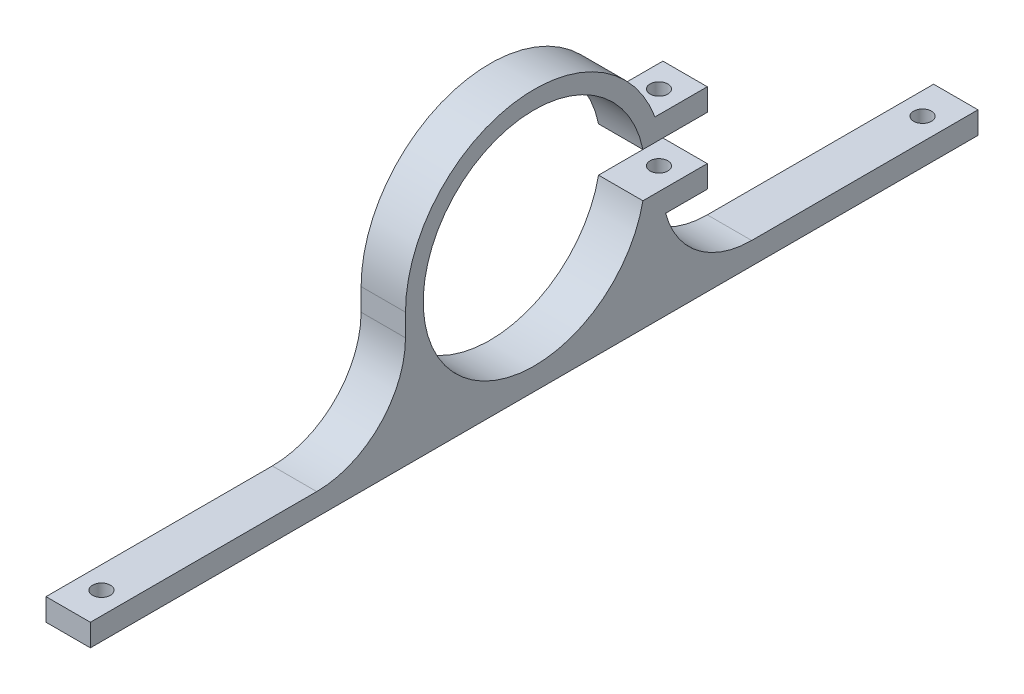
ISO-10303-21;
HEADER;
FILE_DESCRIPTION(('STEP AP214'),'2;1');
FILE_NAME('part.step','',(''),(''),'','','');
FILE_SCHEMA(('AUTOMOTIVE_DESIGN { 1 0 10303 214 1 1 1 1 }'));
ENDSEC;
DATA;
#1=APPLICATION_CONTEXT('core data for automotive mechanical design processes');
#2=APPLICATION_PROTOCOL_DEFINITION('international standard','automotive_design',2000,#1);
#3=PRODUCT_CONTEXT('',#1,'mechanical');
#4=PRODUCT('Part','Part','',(#3));
#5=PRODUCT_RELATED_PRODUCT_CATEGORY('part','',(#4));
#6=PRODUCT_DEFINITION_FORMATION('','',#4);
#7=PRODUCT_DEFINITION_CONTEXT('part definition',#1,'design');
#8=PRODUCT_DEFINITION('design','',#6,#7);
#9=PRODUCT_DEFINITION_SHAPE('','',#8);
#10=(LENGTH_UNIT() NAMED_UNIT(*) SI_UNIT(.MILLI.,.METRE.));
#11=(NAMED_UNIT(*) PLANE_ANGLE_UNIT() SI_UNIT($,.RADIAN.));
#12=(NAMED_UNIT(*) SI_UNIT($,.STERADIAN.) SOLID_ANGLE_UNIT());
#13=UNCERTAINTY_MEASURE_WITH_UNIT(LENGTH_MEASURE(1.E-05),#10,'distance_accuracy_value','');
#14=(GEOMETRIC_REPRESENTATION_CONTEXT(3) GLOBAL_UNCERTAINTY_ASSIGNED_CONTEXT((#13)) GLOBAL_UNIT_ASSIGNED_CONTEXT((#10,
#11,#12)) REPRESENTATION_CONTEXT('',''));
#15=CARTESIAN_POINT('',(0.,0.,0.));
#16=DIRECTION('',(0.,0.,1.));
#17=DIRECTION('',(1.,0.,0.));
#18=AXIS2_PLACEMENT_3D('',#15,#16,#17);
#19=CARTESIAN_POINT('',(10.,40.,0.));
#20=DIRECTION('',(0.,-1.,0.));
#21=DIRECTION('',(0.,0.,-1.));
#22=AXIS2_PLACEMENT_3D('',#19,#20,#21);
#23=PLANE('',#22);
#24=CARTESIAN_POINT('',(5.,40.,-33.1106575888162));
#25=DIRECTION('',(0.,1.,0.));
#26=DIRECTION('',(0.,0.,1.));
#27=AXIS2_PLACEMENT_3D('',#24,#25,#26);
#28=CIRCLE('',#27,2.);
#29=CARTESIAN_POINT('',(5.,40.,-31.1106575888162));
#30=VERTEX_POINT('',#29);
#31=EDGE_CURVE('E293',#30,#30,#28,.T.);
#32=ORIENTED_EDGE('',*,*,#31,.F.);
#33=EDGE_LOOP('',(#32));
#34=FACE_BOUND('',#33,.T.);
#35=DIRECTION('',(0.,0.,1.));
#36=VECTOR('',#35,1.);
#37=CARTESIAN_POINT('',(0.,40.,0.));
#38=LINE('',#37,#36);
#39=CARTESIAN_POINT('',(0.,40.,-39.));
#40=VERTEX_POINT('',#39);
#41=CARTESIAN_POINT('',(0.,40.,-27.2213151776324));
#42=VERTEX_POINT('',#41);
#43=EDGE_CURVE('E191',#40,#42,#38,.T.);
#44=ORIENTED_EDGE('',*,*,#43,.T.);
#45=DIRECTION('',(-1.,0.,0.));
#46=VECTOR('',#45,1.);
#47=CARTESIAN_POINT('',(10.,40.,-27.2213151776324));
#48=LINE('',#47,#46);
#49=CARTESIAN_POINT('',(10.,40.,-27.2213151776324));
#50=VERTEX_POINT('',#49);
#51=EDGE_CURVE('E11',#50,#42,#48,.T.);
#52=ORIENTED_EDGE('',*,*,#51,.F.);
#53=DIRECTION('',(0.,0.,1.));
#54=VECTOR('',#53,1.);
#55=CARTESIAN_POINT('',(10.,40.,0.));
#56=LINE('',#55,#54);
#57=CARTESIAN_POINT('',(10.,40.,-39.));
#58=VERTEX_POINT('',#57);
#59=EDGE_CURVE('E249',#58,#50,#56,.T.);
#60=ORIENTED_EDGE('',*,*,#59,.F.);
#61=DIRECTION('',(-1.,0.,0.));
#62=VECTOR('',#61,1.);
#63=CARTESIAN_POINT('',(10.,40.,-39.));
#64=LINE('',#63,#62);
#65=EDGE_CURVE('E187',#58,#40,#64,.T.);
#66=ORIENTED_EDGE('',*,*,#65,.T.);
#67=EDGE_LOOP('',(#44,#52,#60,#66));
#68=FACE_BOUND('',#67,.T.);
#69=ADVANCED_FACE('F41',(#34,#68),#23,.F.);
#70=CARTESIAN_POINT('',(10.,30.,0.));
#71=DIRECTION('',(-1.,0.,0.));
#72=DIRECTION('',(0.,0.,1.));
#73=AXIS2_PLACEMENT_3D('',#70,#71,#72);
#74=CYLINDRICAL_SURFACE('',#73,29.);
#75=CARTESIAN_POINT('',(0.,30.,0.));
#76=DIRECTION('',(1.,0.,0.));
#77=DIRECTION('',(0.,0.,-1.));
#78=AXIS2_PLACEMENT_3D('',#75,#76,#77);
#79=CIRCLE('',#78,29.);
#80=CARTESIAN_POINT('',(0.,30.,29.));
#81=VERTEX_POINT('',#80);
#82=EDGE_CURVE('E195',#42,#81,#79,.T.);
#83=ORIENTED_EDGE('',*,*,#82,.T.);
#84=DIRECTION('',(-1.,0.,0.));
#85=VECTOR('',#84,1.);
#86=CARTESIAN_POINT('',(10.,30.,29.));
#87=LINE('',#86,#85);
#88=CARTESIAN_POINT('',(10.,30.,29.));
#89=VERTEX_POINT('',#88);
#90=EDGE_CURVE('E51',#89,#81,#87,.T.);
#91=ORIENTED_EDGE('',*,*,#90,.F.);
#92=CARTESIAN_POINT('',(10.,30.,0.));
#93=DIRECTION('',(1.,0.,0.));
#94=DIRECTION('',(0.,0.,-1.));
#95=AXIS2_PLACEMENT_3D('',#92,#93,#94);
#96=CIRCLE('',#95,29.);
#97=EDGE_CURVE('E123',#50,#89,#96,.T.);
#98=ORIENTED_EDGE('',*,*,#97,.F.);
#99=ORIENTED_EDGE('',*,*,#51,.T.);
#100=EDGE_LOOP('',(#83,#91,#98,#99));
#101=FACE_BOUND('',#100,.T.);
#102=ADVANCED_FACE('F379',(#101),#74,.T.);
#103=CARTESIAN_POINT('',(10.,0.,29.));
#104=DIRECTION('',(0.,0.,-1.));
#105=DIRECTION('',(-1.,0.,0.));
#106=AXIS2_PLACEMENT_3D('',#103,#104,#105);
#107=PLANE('',#106);
#108=DIRECTION('',(0.,-1.,0.));
#109=VECTOR('',#108,1.);
#110=CARTESIAN_POINT('',(0.,0.,29.));
#111=LINE('',#110,#109);
#112=CARTESIAN_POINT('',(0.,25.0000000000001,29.));
#113=VERTEX_POINT('',#112);
#114=EDGE_CURVE('E199',#81,#113,#111,.T.);
#115=ORIENTED_EDGE('',*,*,#114,.T.);
#116=DIRECTION('',(-1.,0.,0.));
#117=VECTOR('',#116,1.);
#118=CARTESIAN_POINT('',(10.,25.0000000000001,29.));
#119=LINE('',#118,#117);
#120=CARTESIAN_POINT('',(10.,25.0000000000001,29.));
#121=VERTEX_POINT('',#120);
#122=EDGE_CURVE('E284',#121,#113,#119,.T.);
#123=ORIENTED_EDGE('',*,*,#122,.F.);
#124=DIRECTION('',(0.,-1.,0.));
#125=VECTOR('',#124,1.);
#126=CARTESIAN_POINT('',(10.,0.,29.));
#127=LINE('',#126,#125);
#128=EDGE_CURVE('E317',#89,#121,#127,.T.);
#129=ORIENTED_EDGE('',*,*,#128,.F.);
#130=ORIENTED_EDGE('',*,*,#90,.T.);
#131=EDGE_LOOP('',(#115,#123,#129,#130));
#132=FACE_BOUND('',#131,.T.);
#133=ADVANCED_FACE('F384',(#132),#107,.F.);
#134=CARTESIAN_POINT('',(10.,25.,49.));
#135=DIRECTION('',(-1.,0.,0.));
#136=DIRECTION('',(0.,0.,1.));
#137=AXIS2_PLACEMENT_3D('',#134,#135,#136);
#138=CYLINDRICAL_SURFACE('',#137,20.);
#139=CARTESIAN_POINT('',(0.,25.,49.));
#140=DIRECTION('',(1.,0.,0.));
#141=DIRECTION('',(0.,0.,-1.));
#142=AXIS2_PLACEMENT_3D('',#139,#140,#141);
#143=CIRCLE('',#142,20.);
#144=CARTESIAN_POINT('',(0.,5.,49.0000000000001));
#145=VERTEX_POINT('',#144);
#146=EDGE_CURVE('E203',#145,#113,#143,.T.);
#147=ORIENTED_EDGE('',*,*,#146,.F.);
#148=DIRECTION('',(-1.,0.,0.));
#149=VECTOR('',#148,1.);
#150=CARTESIAN_POINT('',(10.,5.,49.0000000000001));
#151=LINE('',#150,#149);
#152=CARTESIAN_POINT('',(10.,5.,49.0000000000001));
#153=VERTEX_POINT('',#152);
#154=EDGE_CURVE('E281',#153,#145,#151,.T.);
#155=ORIENTED_EDGE('',*,*,#154,.F.);
#156=CARTESIAN_POINT('',(10.,25.,49.));
#157=DIRECTION('',(1.,0.,0.));
#158=DIRECTION('',(0.,0.,-1.));
#159=AXIS2_PLACEMENT_3D('',#156,#157,#158);
#160=CIRCLE('',#159,20.);
#161=EDGE_CURVE('E320',#153,#121,#160,.T.);
#162=ORIENTED_EDGE('',*,*,#161,.T.);
#163=ORIENTED_EDGE('',*,*,#122,.T.);
#164=EDGE_LOOP('',(#147,#155,#162,#163));
#165=FACE_BOUND('',#164,.T.);
#166=ADVANCED_FACE('F398',(#165),#138,.F.);
#167=CARTESIAN_POINT('',(10.,5.,0.));
#168=DIRECTION('',(0.,-1.,0.));
#169=DIRECTION('',(0.,0.,-1.));
#170=AXIS2_PLACEMENT_3D('',#167,#168,#169);
#171=PLANE('',#170);
#172=CARTESIAN_POINT('',(5.,5.,92.5));
#173=DIRECTION('',(0.,1.,0.));
#174=DIRECTION('',(0.,0.,1.));
#175=AXIS2_PLACEMENT_3D('',#172,#173,#174);
#176=CIRCLE('',#175,2.);
#177=CARTESIAN_POINT('',(5.,5.,94.5));
#178=VERTEX_POINT('',#177);
#179=EDGE_CURVE('E624',#178,#178,#176,.T.);
#180=ORIENTED_EDGE('',*,*,#179,.F.);
#181=EDGE_LOOP('',(#180));
#182=FACE_BOUND('',#181,.T.);
#183=DIRECTION('',(0.,0.,1.));
#184=VECTOR('',#183,1.);
#185=CARTESIAN_POINT('',(0.,5.,0.));
#186=LINE('',#185,#184);
#187=CARTESIAN_POINT('',(0.,5.,100.));
#188=VERTEX_POINT('',#187);
#189=EDGE_CURVE('E207',#145,#188,#186,.T.);
#190=ORIENTED_EDGE('',*,*,#189,.T.);
#191=DIRECTION('',(-1.,0.,0.));
#192=VECTOR('',#191,1.);
#193=CARTESIAN_POINT('',(10.,5.,100.));
#194=LINE('',#193,#192);
#195=CARTESIAN_POINT('',(10.,5.,100.));
#196=VERTEX_POINT('',#195);
#197=EDGE_CURVE('E278',#196,#188,#194,.T.);
#198=ORIENTED_EDGE('',*,*,#197,.F.);
#199=DIRECTION('',(0.,0.,1.));
#200=VECTOR('',#199,1.);
#201=CARTESIAN_POINT('',(10.,5.,0.));
#202=LINE('',#201,#200);
#203=EDGE_CURVE('E324',#153,#196,#202,.T.);
#204=ORIENTED_EDGE('',*,*,#203,.F.);
#205=ORIENTED_EDGE('',*,*,#154,.T.);
#206=EDGE_LOOP('',(#190,#198,#204,#205));
#207=FACE_BOUND('',#206,.T.);
#208=ADVANCED_FACE('F401',(#182,#207),#171,.F.);
#209=CARTESIAN_POINT('',(10.,0.,100.));
#210=DIRECTION('',(0.,0.,1.));
#211=DIRECTION('',(1.,0.,0.));
#212=AXIS2_PLACEMENT_3D('',#209,#210,#211);
#213=PLANE('',#212);
#214=DIRECTION('',(0.,1.,0.));
#215=VECTOR('',#214,1.);
#216=CARTESIAN_POINT('',(0.,0.,100.));
#217=LINE('',#216,#215);
#218=CARTESIAN_POINT('',(0.,0.,100.));
#219=VERTEX_POINT('',#218);
#220=EDGE_CURVE('E211',#219,#188,#217,.T.);
#221=ORIENTED_EDGE('',*,*,#220,.F.);
#222=DIRECTION('',(-1.,0.,0.));
#223=VECTOR('',#222,1.);
#224=CARTESIAN_POINT('',(10.,0.,100.));
#225=LINE('',#224,#223);
#226=CARTESIAN_POINT('',(10.,0.,100.));
#227=VERTEX_POINT('',#226);
#228=EDGE_CURVE('E275',#227,#219,#225,.T.);
#229=ORIENTED_EDGE('',*,*,#228,.F.);
#230=DIRECTION('',(0.,1.,0.));
#231=VECTOR('',#230,1.);
#232=CARTESIAN_POINT('',(10.,0.,100.));
#233=LINE('',#232,#231);
#234=EDGE_CURVE('E327',#227,#196,#233,.T.);
#235=ORIENTED_EDGE('',*,*,#234,.T.);
#236=ORIENTED_EDGE('',*,*,#197,.T.);
#237=EDGE_LOOP('',(#221,#229,#235,#236));
#238=FACE_BOUND('',#237,.T.);
#239=ADVANCED_FACE('F404',(#238),#213,.T.);
#240=CARTESIAN_POINT('',(10.,0.,0.));
#241=DIRECTION('',(0.,1.,0.));
#242=DIRECTION('',(0.,0.,1.));
#243=AXIS2_PLACEMENT_3D('',#240,#241,#242);
#244=PLANE('',#243);
#245=CARTESIAN_POINT('',(5.,0.,92.5));
#246=DIRECTION('',(0.,1.,0.));
#247=DIRECTION('',(0.,0.,1.));
#248=AXIS2_PLACEMENT_3D('',#245,#246,#247);
#249=CIRCLE('',#248,2.);
#250=CARTESIAN_POINT('',(5.,0.,94.5));
#251=VERTEX_POINT('',#250);
#252=EDGE_CURVE('E44',#251,#251,#249,.T.);
#253=ORIENTED_EDGE('',*,*,#252,.T.);
#254=EDGE_LOOP('',(#253));
#255=FACE_BOUND('',#254,.T.);
#256=CARTESIAN_POINT('',(4.99999999999999,0.,-92.5));
#257=DIRECTION('',(0.,1.,0.));
#258=DIRECTION('',(0.,0.,1.));
#259=AXIS2_PLACEMENT_3D('',#256,#257,#258);
#260=CIRCLE('',#259,2.);
#261=CARTESIAN_POINT('',(4.99999999999999,0.,-90.5));
#262=VERTEX_POINT('',#261);
#263=EDGE_CURVE('E306',#262,#262,#260,.T.);
#264=ORIENTED_EDGE('',*,*,#263,.T.);
#265=EDGE_LOOP('',(#264));
#266=FACE_BOUND('',#265,.T.);
#267=DIRECTION('',(0.,0.,-1.));
#268=VECTOR('',#267,1.);
#269=CARTESIAN_POINT('',(0.,0.,0.));
#270=LINE('',#269,#268);
#271=CARTESIAN_POINT('',(0.,0.,-100.));
#272=VERTEX_POINT('',#271);
#273=EDGE_CURVE('E215',#219,#272,#270,.T.);
#274=ORIENTED_EDGE('',*,*,#273,.T.);
#275=DIRECTION('',(-1.,0.,0.));
#276=VECTOR('',#275,1.);
#277=CARTESIAN_POINT('',(10.,0.,-100.));
#278=LINE('',#277,#276);
#279=CARTESIAN_POINT('',(10.,0.,-100.));
#280=VERTEX_POINT('',#279);
#281=EDGE_CURVE('E271',#280,#272,#278,.T.);
#282=ORIENTED_EDGE('',*,*,#281,.F.);
#283=DIRECTION('',(0.,0.,-1.));
#284=VECTOR('',#283,1.);
#285=CARTESIAN_POINT('',(10.,0.,0.));
#286=LINE('',#285,#284);
#287=EDGE_CURVE('E331',#227,#280,#286,.T.);
#288=ORIENTED_EDGE('',*,*,#287,.F.);
#289=ORIENTED_EDGE('',*,*,#228,.T.);
#290=EDGE_LOOP('',(#274,#282,#288,#289));
#291=FACE_BOUND('',#290,.T.);
#292=ADVANCED_FACE('F410',(#255,#266,#291),#244,.F.);
#293=CARTESIAN_POINT('',(10.,0.,-100.));
#294=DIRECTION('',(0.,0.,1.));
#295=DIRECTION('',(1.,0.,0.));
#296=AXIS2_PLACEMENT_3D('',#293,#294,#295);
#297=PLANE('',#296);
#298=DIRECTION('',(0.,1.,0.));
#299=VECTOR('',#298,1.);
#300=CARTESIAN_POINT('',(0.,0.,-100.));
#301=LINE('',#300,#299);
#302=CARTESIAN_POINT('',(0.,5.,-100.));
#303=VERTEX_POINT('',#302);
#304=EDGE_CURVE('E218',#272,#303,#301,.T.);
#305=ORIENTED_EDGE('',*,*,#304,.T.);
#306=DIRECTION('',(-1.,0.,0.));
#307=VECTOR('',#306,1.);
#308=CARTESIAN_POINT('',(10.,5.,-100.));
#309=LINE('',#308,#307);
#310=CARTESIAN_POINT('',(10.,5.,-100.));
#311=VERTEX_POINT('',#310);
#312=EDGE_CURVE('E268',#311,#303,#309,.T.);
#313=ORIENTED_EDGE('',*,*,#312,.F.);
#314=DIRECTION('',(0.,1.,0.));
#315=VECTOR('',#314,1.);
#316=CARTESIAN_POINT('',(10.,0.,-100.));
#317=LINE('',#316,#315);
#318=EDGE_CURVE('E334',#280,#311,#317,.T.);
#319=ORIENTED_EDGE('',*,*,#318,.F.);
#320=ORIENTED_EDGE('',*,*,#281,.T.);
#321=EDGE_LOOP('',(#305,#313,#319,#320));
#322=FACE_BOUND('',#321,.T.);
#323=ADVANCED_FACE('F414',(#322),#297,.F.);
#324=CARTESIAN_POINT('',(10.,5.,0.));
#325=DIRECTION('',(0.,1.,0.));
#326=DIRECTION('',(0.,0.,1.));
#327=AXIS2_PLACEMENT_3D('',#324,#325,#326);
#328=PLANE('',#327);
#329=CARTESIAN_POINT('',(4.99999999999999,5.,-92.5));
#330=DIRECTION('',(0.,1.,0.));
#331=DIRECTION('',(0.,0.,1.));
#332=AXIS2_PLACEMENT_3D('',#329,#330,#331);
#333=CIRCLE('',#332,2.);
#334=CARTESIAN_POINT('',(4.99999999999999,5.,-90.5));
#335=VERTEX_POINT('',#334);
#336=EDGE_CURVE('E632',#335,#335,#333,.T.);
#337=ORIENTED_EDGE('',*,*,#336,.F.);
#338=EDGE_LOOP('',(#337));
#339=FACE_BOUND('',#338,.T.);
#340=DIRECTION('',(0.,0.,-1.));
#341=VECTOR('',#340,1.);
#342=CARTESIAN_POINT('',(0.,5.,0.));
#343=LINE('',#342,#341);
#344=CARTESIAN_POINT('',(0.,5.,-49.0000000000001));
#345=VERTEX_POINT('',#344);
#346=EDGE_CURVE('E222',#345,#303,#343,.T.);
#347=ORIENTED_EDGE('',*,*,#346,.F.);
#348=DIRECTION('',(-1.,0.,0.));
#349=VECTOR('',#348,1.);
#350=CARTESIAN_POINT('',(10.,5.,-49.0000000000001));
#351=LINE('',#350,#349);
#352=CARTESIAN_POINT('',(10.,5.,-49.0000000000001));
#353=VERTEX_POINT('',#352);
#354=EDGE_CURVE('E265',#353,#345,#351,.T.);
#355=ORIENTED_EDGE('',*,*,#354,.F.);
#356=DIRECTION('',(0.,0.,-1.));
#357=VECTOR('',#356,1.);
#358=CARTESIAN_POINT('',(10.,5.,0.));
#359=LINE('',#358,#357);
#360=EDGE_CURVE('E337',#353,#311,#359,.T.);
#361=ORIENTED_EDGE('',*,*,#360,.T.);
#362=ORIENTED_EDGE('',*,*,#312,.T.);
#363=EDGE_LOOP('',(#347,#355,#361,#362));
#364=FACE_BOUND('',#363,.T.);
#365=ADVANCED_FACE('F417',(#339,#364),#328,.T.);
#366=CARTESIAN_POINT('',(10.,25.,-49.));
#367=DIRECTION('',(-1.,0.,0.));
#368=DIRECTION('',(0.,0.,1.));
#369=AXIS2_PLACEMENT_3D('',#366,#367,#368);
#370=CYLINDRICAL_SURFACE('',#369,20.);
#371=CARTESIAN_POINT('',(0.,25.,-49.));
#372=DIRECTION('',(1.,0.,0.));
#373=DIRECTION('',(0.,0.,-1.));
#374=AXIS2_PLACEMENT_3D('',#371,#372,#373);
#375=CIRCLE('',#374,20.);
#376=CARTESIAN_POINT('',(0.,20.0000000000001,-29.6350832689629));
#377=VERTEX_POINT('',#376);
#378=EDGE_CURVE('E226',#345,#377,#375,.F.);
#379=ORIENTED_EDGE('',*,*,#378,.T.);
#380=DIRECTION('',(-1.,0.,0.));
#381=VECTOR('',#380,1.);
#382=CARTESIAN_POINT('',(10.,20.0000000000001,-29.6350832689629));
#383=LINE('',#382,#381);
#384=CARTESIAN_POINT('',(10.,20.0000000000001,-29.6350832689629));
#385=VERTEX_POINT('',#384);
#386=EDGE_CURVE('E262',#385,#377,#383,.T.);
#387=ORIENTED_EDGE('',*,*,#386,.F.);
#388=CARTESIAN_POINT('',(10.,25.,-49.));
#389=DIRECTION('',(1.,0.,0.));
#390=DIRECTION('',(0.,0.,-1.));
#391=AXIS2_PLACEMENT_3D('',#388,#389,#390);
#392=CIRCLE('',#391,20.);
#393=EDGE_CURVE('E341',#353,#385,#392,.F.);
#394=ORIENTED_EDGE('',*,*,#393,.F.);
#395=ORIENTED_EDGE('',*,*,#354,.T.);
#396=EDGE_LOOP('',(#379,#387,#394,#395));
#397=FACE_BOUND('',#396,.T.);
#398=ADVANCED_FACE('F419',(#397),#370,.F.);
#399=CARTESIAN_POINT('',(10.,20.0000000000001,0.));
#400=DIRECTION('',(0.,-1.,0.));
#401=DIRECTION('',(0.,0.,-1.));
#402=AXIS2_PLACEMENT_3D('',#399,#400,#401);
#403=PLANE('',#402);
#404=CARTESIAN_POINT('',(5.,20.0000000000001,-33.1106575888162));
#405=DIRECTION('',(0.,-1.,0.));
#406=DIRECTION('',(0.,0.,-1.));
#407=AXIS2_PLACEMENT_3D('',#404,#405,#406);
#408=CIRCLE('',#407,2.);
#409=CARTESIAN_POINT('',(5.,20.0000000000001,-35.1106575888162));
#410=VERTEX_POINT('',#409);
#411=EDGE_CURVE('E196',#410,#410,#408,.T.);
#412=ORIENTED_EDGE('',*,*,#411,.F.);
#413=EDGE_LOOP('',(#412));
#414=FACE_BOUND('',#413,.T.);
#415=DIRECTION('',(0.,0.,1.));
#416=VECTOR('',#415,1.);
#417=CARTESIAN_POINT('',(0.,20.0000000000001,0.));
#418=LINE('',#417,#416);
#419=CARTESIAN_POINT('',(0.,20.0000000000001,-39.));
#420=VERTEX_POINT('',#419);
#421=EDGE_CURVE('E230',#420,#377,#418,.T.);
#422=ORIENTED_EDGE('',*,*,#421,.F.);
#423=DIRECTION('',(-1.,0.,0.));
#424=VECTOR('',#423,1.);
#425=CARTESIAN_POINT('',(10.,20.0000000000001,-39.));
#426=LINE('',#425,#424);
#427=CARTESIAN_POINT('',(10.,20.0000000000001,-39.));
#428=VERTEX_POINT('',#427);
#429=EDGE_CURVE('E259',#428,#420,#426,.T.);
#430=ORIENTED_EDGE('',*,*,#429,.F.);
#431=DIRECTION('',(0.,0.,1.));
#432=VECTOR('',#431,1.);
#433=CARTESIAN_POINT('',(10.,20.0000000000001,0.));
#434=LINE('',#433,#432);
#435=EDGE_CURVE('E344',#428,#385,#434,.T.);
#436=ORIENTED_EDGE('',*,*,#435,.T.);
#437=ORIENTED_EDGE('',*,*,#386,.T.);
#438=EDGE_LOOP('',(#422,#430,#436,#437));
#439=FACE_BOUND('',#438,.T.);
#440=ADVANCED_FACE('F361',(#414,#439),#403,.T.);
#441=CARTESIAN_POINT('',(10.,0.,-39.));
#442=DIRECTION('',(0.,0.,-1.));
#443=DIRECTION('',(-1.,0.,0.));
#444=AXIS2_PLACEMENT_3D('',#441,#442,#443);
#445=PLANE('',#444);
#446=DIRECTION('',(0.,-1.,0.));
#447=VECTOR('',#446,1.);
#448=CARTESIAN_POINT('',(0.,0.,-39.));
#449=LINE('',#448,#447);
#450=CARTESIAN_POINT('',(0.,25.,-39.));
#451=VERTEX_POINT('',#450);
#452=EDGE_CURVE('E234',#451,#420,#449,.T.);
#453=ORIENTED_EDGE('',*,*,#452,.F.);
#454=DIRECTION('',(-1.,0.,0.));
#455=VECTOR('',#454,1.);
#456=CARTESIAN_POINT('',(10.,25.,-39.));
#457=LINE('',#456,#455);
#458=CARTESIAN_POINT('',(10.,25.,-39.));
#459=VERTEX_POINT('',#458);
#460=EDGE_CURVE('E256',#459,#451,#457,.T.);
#461=ORIENTED_EDGE('',*,*,#460,.F.);
#462=DIRECTION('',(0.,-1.,0.));
#463=VECTOR('',#462,1.);
#464=CARTESIAN_POINT('',(10.,0.,-39.));
#465=LINE('',#464,#463);
#466=EDGE_CURVE('E348',#459,#428,#465,.T.);
#467=ORIENTED_EDGE('',*,*,#466,.T.);
#468=ORIENTED_EDGE('',*,*,#429,.T.);
#469=EDGE_LOOP('',(#453,#461,#467,#468));
#470=FACE_BOUND('',#469,.T.);
#471=ADVANCED_FACE('F354',(#470),#445,.T.);
#472=CARTESIAN_POINT('',(10.,25.0000000000004,-2.57127135419677E-13));
#473=DIRECTION('',(0.,-1.,0.));
#474=DIRECTION('',(0.,0.,-1.));
#475=AXIS2_PLACEMENT_3D('',#472,#473,#474);
#476=PLANE('',#475);
#477=CARTESIAN_POINT('',(5.,25.0000000000001,-33.1106575888162));
#478=DIRECTION('',(0.,-1.,0.));
#479=DIRECTION('',(0.,0.,-1.));
#480=AXIS2_PLACEMENT_3D('',#477,#478,#479);
#481=CIRCLE('',#480,2.);
#482=CARTESIAN_POINT('',(5.,25.,-35.1106575888162));
#483=VERTEX_POINT('',#482);
#484=EDGE_CURVE('E292',#483,#483,#481,.T.);
#485=ORIENTED_EDGE('',*,*,#484,.T.);
#486=EDGE_LOOP('',(#485));
#487=FACE_BOUND('',#486,.T.);
#488=DIRECTION('',(0.,0.,1.));
#489=VECTOR('',#488,1.);
#490=CARTESIAN_POINT('',(0.,25.0000000000004,-2.57127135419677E-13));
#491=LINE('',#490,#489);
#492=CARTESIAN_POINT('',(0.,25.0000000000001,-24.4948974278318));
#493=VERTEX_POINT('',#492);
#494=EDGE_CURVE('E238',#451,#493,#491,.T.);
#495=ORIENTED_EDGE('',*,*,#494,.T.);
#496=DIRECTION('',(-1.,0.,0.));
#497=VECTOR('',#496,1.);
#498=CARTESIAN_POINT('',(10.,25.0000000000001,-24.4948974278318));
#499=LINE('',#498,#497);
#500=CARTESIAN_POINT('',(10.,25.0000000000001,-24.4948974278318));
#501=VERTEX_POINT('',#500);
#502=EDGE_CURVE('E173',#501,#493,#499,.T.);
#503=ORIENTED_EDGE('',*,*,#502,.F.);
#504=DIRECTION('',(0.,0.,1.));
#505=VECTOR('',#504,1.);
#506=CARTESIAN_POINT('',(10.,25.0000000000004,-2.57127135419677E-13));
#507=LINE('',#506,#505);
#508=EDGE_CURVE('E179',#459,#501,#507,.T.);
#509=ORIENTED_EDGE('',*,*,#508,.F.);
#510=ORIENTED_EDGE('',*,*,#460,.T.);
#511=EDGE_LOOP('',(#495,#503,#509,#510));
#512=FACE_BOUND('',#511,.T.);
#513=ADVANCED_FACE('F368',(#487,#512),#476,.F.);
#514=CARTESIAN_POINT('',(10.,30.,0.));
#515=DIRECTION('',(-1.,0.,0.));
#516=DIRECTION('',(0.,0.,1.));
#517=AXIS2_PLACEMENT_3D('',#514,#515,#516);
#518=CYLINDRICAL_SURFACE('',#517,25.);
#519=CARTESIAN_POINT('',(0.,30.,0.));
#520=DIRECTION('',(1.,0.,0.));
#521=DIRECTION('',(0.,0.,-1.));
#522=AXIS2_PLACEMENT_3D('',#519,#520,#521);
#523=CIRCLE('',#522,25.);
#524=CARTESIAN_POINT('',(0.,35.,-24.4948974278318));
#525=VERTEX_POINT('',#524);
#526=EDGE_CURVE('E167',#525,#493,#523,.T.);
#527=ORIENTED_EDGE('',*,*,#526,.F.);
#528=DIRECTION('',(-1.,0.,0.));
#529=VECTOR('',#528,1.);
#530=CARTESIAN_POINT('',(10.,35.,-24.4948974278318));
#531=LINE('',#530,#529);
#532=CARTESIAN_POINT('',(10.,35.,-24.4948974278318));
#533=VERTEX_POINT('',#532);
#534=EDGE_CURVE('E162',#533,#525,#531,.T.);
#535=ORIENTED_EDGE('',*,*,#534,.F.);
#536=CARTESIAN_POINT('',(10.,30.,0.));
#537=DIRECTION('',(1.,0.,0.));
#538=DIRECTION('',(0.,0.,-1.));
#539=AXIS2_PLACEMENT_3D('',#536,#537,#538);
#540=CIRCLE('',#539,25.);
#541=EDGE_CURVE('E165',#533,#501,#540,.T.);
#542=ORIENTED_EDGE('',*,*,#541,.T.);
#543=ORIENTED_EDGE('',*,*,#502,.T.);
#544=EDGE_LOOP('',(#527,#535,#542,#543));
#545=FACE_BOUND('',#544,.T.);
#546=ADVANCED_FACE('F164',(#545),#518,.F.);
#547=CARTESIAN_POINT('',(10.,35.,0.));
#548=DIRECTION('',(0.,-1.,0.));
#549=DIRECTION('',(0.,0.,-1.));
#550=AXIS2_PLACEMENT_3D('',#547,#548,#549);
#551=PLANE('',#550);
#552=CARTESIAN_POINT('',(5.,35.,-33.1106575888162));
#553=DIRECTION('',(0.,-1.,0.));
#554=DIRECTION('',(0.,0.,-1.));
#555=AXIS2_PLACEMENT_3D('',#552,#553,#554);
#556=CIRCLE('',#555,2.);
#557=CARTESIAN_POINT('',(5.,35.,-35.1106575888162));
#558=VERTEX_POINT('',#557);
#559=EDGE_CURVE('E289',#558,#558,#556,.T.);
#560=ORIENTED_EDGE('',*,*,#559,.F.);
#561=EDGE_LOOP('',(#560));
#562=FACE_BOUND('',#561,.T.);
#563=DIRECTION('',(0.,0.,1.));
#564=VECTOR('',#563,1.);
#565=CARTESIAN_POINT('',(0.,35.,0.));
#566=LINE('',#565,#564);
#567=CARTESIAN_POINT('',(0.,35.,-39.));
#568=VERTEX_POINT('',#567);
#569=EDGE_CURVE('E244',#568,#525,#566,.T.);
#570=ORIENTED_EDGE('',*,*,#569,.F.);
#571=DIRECTION('',(-1.,0.,0.));
#572=VECTOR('',#571,1.);
#573=CARTESIAN_POINT('',(10.,35.,-39.));
#574=LINE('',#573,#572);
#575=CARTESIAN_POINT('',(10.,35.,-39.));
#576=VERTEX_POINT('',#575);
#577=EDGE_CURVE('E112',#576,#568,#574,.T.);
#578=ORIENTED_EDGE('',*,*,#577,.F.);
#579=DIRECTION('',(0.,0.,1.));
#580=VECTOR('',#579,1.);
#581=CARTESIAN_POINT('',(10.,35.,0.));
#582=LINE('',#581,#580);
#583=EDGE_CURVE('E176',#576,#533,#582,.T.);
#584=ORIENTED_EDGE('',*,*,#583,.T.);
#585=ORIENTED_EDGE('',*,*,#534,.T.);
#586=EDGE_LOOP('',(#570,#578,#584,#585));
#587=FACE_BOUND('',#586,.T.);
#588=ADVANCED_FACE('F183',(#562,#587),#551,.T.);
#589=CARTESIAN_POINT('',(10.,1.08246744900953E-13,-39.0000000000001));
#590=DIRECTION('',(0.,0.,1.));
#591=DIRECTION('',(0.,-1.,0.));
#592=AXIS2_PLACEMENT_3D('',#589,#590,#591);
#593=PLANE('',#592);
#594=DIRECTION('',(0.,1.,0.));
#595=VECTOR('',#594,1.);
#596=CARTESIAN_POINT('',(0.,1.08246744900953E-13,-39.0000000000001));
#597=LINE('',#596,#595);
#598=EDGE_CURVE('E115',#568,#40,#597,.T.);
#599=ORIENTED_EDGE('',*,*,#598,.T.);
#600=ORIENTED_EDGE('',*,*,#65,.F.);
#601=DIRECTION('',(0.,1.,0.));
#602=VECTOR('',#601,1.);
#603=CARTESIAN_POINT('',(10.,1.08246744900953E-13,-39.0000000000001));
#604=LINE('',#603,#602);
#605=EDGE_CURVE('E60',#576,#58,#604,.T.);
#606=ORIENTED_EDGE('',*,*,#605,.F.);
#607=ORIENTED_EDGE('',*,*,#577,.T.);
#608=EDGE_LOOP('',(#599,#600,#606,#607));
#609=FACE_BOUND('',#608,.T.);
#610=ADVANCED_FACE('F509',(#609),#593,.F.);
#611=CARTESIAN_POINT('',(10.,0.,0.));
#612=DIRECTION('',(1.,0.,0.));
#613=DIRECTION('',(0.,0.,-1.));
#614=AXIS2_PLACEMENT_3D('',#611,#612,#613);
#615=PLANE('',#614);
#616=ORIENTED_EDGE('',*,*,#59,.T.);
#617=ORIENTED_EDGE('',*,*,#97,.T.);
#618=ORIENTED_EDGE('',*,*,#128,.T.);
#619=ORIENTED_EDGE('',*,*,#161,.F.);
#620=ORIENTED_EDGE('',*,*,#203,.T.);
#621=ORIENTED_EDGE('',*,*,#234,.F.);
#622=ORIENTED_EDGE('',*,*,#287,.T.);
#623=ORIENTED_EDGE('',*,*,#318,.T.);
#624=ORIENTED_EDGE('',*,*,#360,.F.);
#625=ORIENTED_EDGE('',*,*,#393,.T.);
#626=ORIENTED_EDGE('',*,*,#435,.F.);
#627=ORIENTED_EDGE('',*,*,#466,.F.);
#628=ORIENTED_EDGE('',*,*,#508,.T.);
#629=ORIENTED_EDGE('',*,*,#541,.F.);
#630=ORIENTED_EDGE('',*,*,#583,.F.);
#631=ORIENTED_EDGE('',*,*,#605,.T.);
#632=EDGE_LOOP('',(#616,#617,#618,#619,#620,#621,#622,#623,#624,#625,#626,#627,#628,#629,#630,#631));
#633=FACE_BOUND('',#632,.T.);
#634=ADVANCED_FACE('F175',(#633),#615,.T.);
#635=CARTESIAN_POINT('',(0.,0.,0.));
#636=DIRECTION('',(1.,0.,0.));
#637=DIRECTION('',(0.,0.,-1.));
#638=AXIS2_PLACEMENT_3D('',#635,#636,#637);
#639=PLANE('',#638);
#640=ORIENTED_EDGE('',*,*,#43,.F.);
#641=ORIENTED_EDGE('',*,*,#598,.F.);
#642=ORIENTED_EDGE('',*,*,#569,.T.);
#643=ORIENTED_EDGE('',*,*,#526,.T.);
#644=ORIENTED_EDGE('',*,*,#494,.F.);
#645=ORIENTED_EDGE('',*,*,#452,.T.);
#646=ORIENTED_EDGE('',*,*,#421,.T.);
#647=ORIENTED_EDGE('',*,*,#378,.F.);
#648=ORIENTED_EDGE('',*,*,#346,.T.);
#649=ORIENTED_EDGE('',*,*,#304,.F.);
#650=ORIENTED_EDGE('',*,*,#273,.F.);
#651=ORIENTED_EDGE('',*,*,#220,.T.);
#652=ORIENTED_EDGE('',*,*,#189,.F.);
#653=ORIENTED_EDGE('',*,*,#146,.T.);
#654=ORIENTED_EDGE('',*,*,#114,.F.);
#655=ORIENTED_EDGE('',*,*,#82,.F.);
#656=EDGE_LOOP('',(#640,#641,#642,#643,#644,#645,#646,#647,#648,#649,#650,#651,#652,#653,#654,#655));
#657=FACE_BOUND('',#656,.T.);
#658=ADVANCED_FACE('F366',(#657),#639,.F.);
#659=CARTESIAN_POINT('',(5.,17.,-33.1106575888162));
#660=DIRECTION('',(0.,1.,0.));
#661=DIRECTION('',(0.,0.,1.));
#662=AXIS2_PLACEMENT_3D('',#659,#660,#661);
#663=CYLINDRICAL_SURFACE('',#662,2.);
#664=ORIENTED_EDGE('',*,*,#559,.T.);
#665=EDGE_LOOP('',(#664));
#666=FACE_BOUND('',#665,.T.);
#667=ORIENTED_EDGE('',*,*,#31,.T.);
#668=EDGE_LOOP('',(#667));
#669=FACE_BOUND('',#668,.T.);
#670=ADVANCED_FACE('F504',(#666,#669),#663,.F.);
#671=ORIENTED_EDGE('',*,*,#411,.T.);
#672=EDGE_LOOP('',(#671));
#673=FACE_BOUND('',#672,.T.);
#674=ORIENTED_EDGE('',*,*,#484,.F.);
#675=EDGE_LOOP('',(#674));
#676=FACE_BOUND('',#675,.T.);
#677=ADVANCED_FACE('F485',(#673,#676),#663,.F.);
#678=CARTESIAN_POINT('',(4.99999999999999,-18.,-92.5));
#679=DIRECTION('',(0.,1.,0.));
#680=DIRECTION('',(0.,0.,1.));
#681=AXIS2_PLACEMENT_3D('',#678,#679,#680);
#682=CYLINDRICAL_SURFACE('',#681,2.);
#683=ORIENTED_EDGE('',*,*,#336,.T.);
#684=EDGE_LOOP('',(#683));
#685=FACE_BOUND('',#684,.T.);
#686=ORIENTED_EDGE('',*,*,#263,.F.);
#687=EDGE_LOOP('',(#686));
#688=FACE_BOUND('',#687,.T.);
#689=ADVANCED_FACE('F479',(#685,#688),#682,.F.);
#690=CARTESIAN_POINT('',(5.,-18.,92.5));
#691=DIRECTION('',(0.,1.,0.));
#692=DIRECTION('',(0.,0.,1.));
#693=AXIS2_PLACEMENT_3D('',#690,#691,#692);
#694=CYLINDRICAL_SURFACE('',#693,2.);
#695=ORIENTED_EDGE('',*,*,#179,.T.);
#696=EDGE_LOOP('',(#695));
#697=FACE_BOUND('',#696,.T.);
#698=ORIENTED_EDGE('',*,*,#252,.F.);
#699=EDGE_LOOP('',(#698));
#700=FACE_BOUND('',#699,.T.);
#701=ADVANCED_FACE('F484',(#697,#700),#694,.F.);
#702=CLOSED_SHELL('',(#69,#102,#133,#166,#208,#239,#292,#323,#365,#398,#440,#471,#513,#546,#588,
#610,#634,#658,#670,#677,#689,#701));
#703=MANIFOLD_SOLID_BREP('B2',#702);
#704=ADVANCED_BREP_SHAPE_REPRESENTATION('',(#18,#703),#14);
#705=SHAPE_DEFINITION_REPRESENTATION(#9,#704);
ENDSEC;
END-ISO-10303-21;
